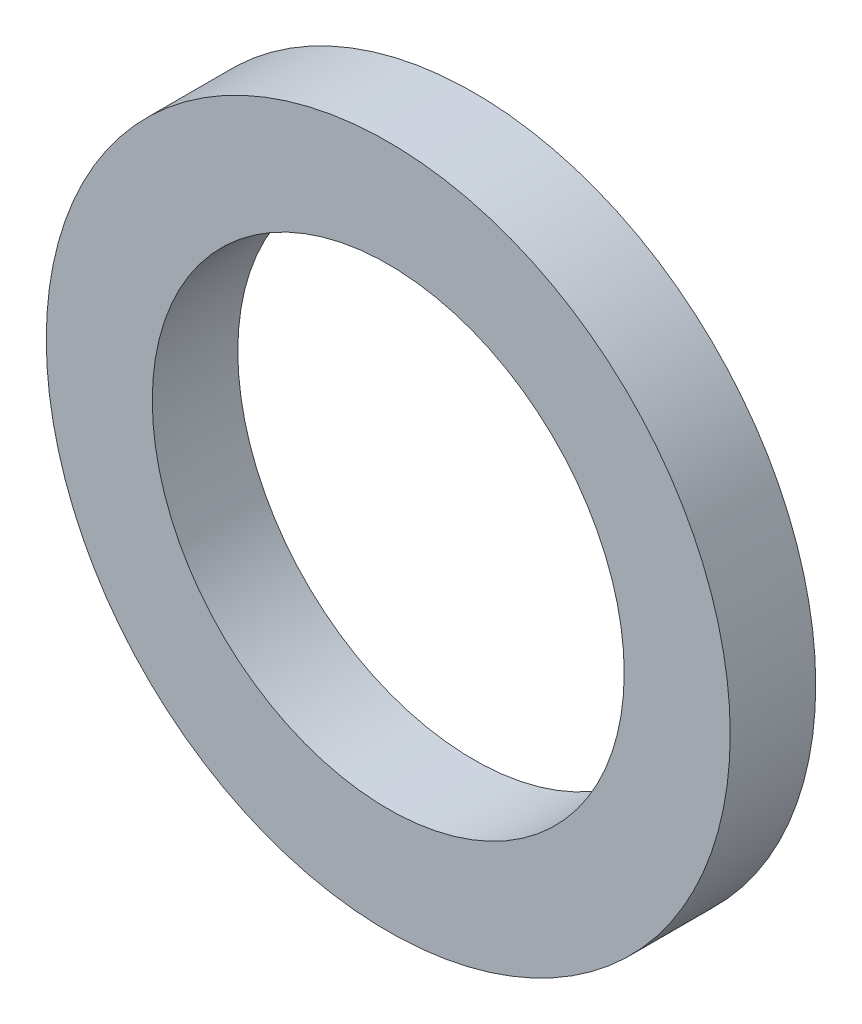
ISO-10303-21;
HEADER;
FILE_DESCRIPTION(('STEP AP214'),'2;1');
FILE_NAME('part.step','',(''),(''),'','','');
FILE_SCHEMA(('AUTOMOTIVE_DESIGN { 1 0 10303 214 1 1 1 1 }'));
ENDSEC;
DATA;
#1=APPLICATION_CONTEXT('core data for automotive mechanical design processes');
#2=APPLICATION_PROTOCOL_DEFINITION('international standard','automotive_design',2000,#1);
#3=PRODUCT_CONTEXT('',#1,'mechanical');
#4=PRODUCT('Part','Part','',(#3));
#5=PRODUCT_RELATED_PRODUCT_CATEGORY('part','',(#4));
#6=PRODUCT_DEFINITION_FORMATION('','',#4);
#7=PRODUCT_DEFINITION_CONTEXT('part definition',#1,'design');
#8=PRODUCT_DEFINITION('design','',#6,#7);
#9=PRODUCT_DEFINITION_SHAPE('','',#8);
#10=(LENGTH_UNIT() NAMED_UNIT(*) SI_UNIT(.MILLI.,.METRE.));
#11=(NAMED_UNIT(*) PLANE_ANGLE_UNIT() SI_UNIT($,.RADIAN.));
#12=(NAMED_UNIT(*) SI_UNIT($,.STERADIAN.) SOLID_ANGLE_UNIT());
#13=UNCERTAINTY_MEASURE_WITH_UNIT(LENGTH_MEASURE(1.E-05),#10,'distance_accuracy_value','');
#14=(GEOMETRIC_REPRESENTATION_CONTEXT(3) GLOBAL_UNCERTAINTY_ASSIGNED_CONTEXT((#13)) GLOBAL_UNIT_ASSIGNED_CONTEXT((#10,
#11,#12)) REPRESENTATION_CONTEXT('',''));
#15=CARTESIAN_POINT('',(0.,0.,0.));
#16=DIRECTION('',(0.,0.,1.));
#17=DIRECTION('',(1.,0.,0.));
#18=AXIS2_PLACEMENT_3D('',#15,#16,#17);
#19=CARTESIAN_POINT('',(0.,0.,3.175));
#20=DIRECTION('',(0.,0.,-1.));
#21=DIRECTION('',(-1.,0.,0.));
#22=AXIS2_PLACEMENT_3D('',#19,#20,#21);
#23=CYLINDRICAL_SURFACE('',#22,12.7);
#24=CARTESIAN_POINT('',(0.,0.,3.175));
#25=DIRECTION('',(0.,0.,1.));
#26=DIRECTION('',(1.,0.,0.));
#27=AXIS2_PLACEMENT_3D('',#24,#25,#26);
#28=CIRCLE('',#27,12.7);
#29=CARTESIAN_POINT('',(12.7,0.,3.175));
#30=VERTEX_POINT('',#29);
#31=EDGE_CURVE('E10',#30,#30,#28,.T.);
#32=ORIENTED_EDGE('',*,*,#31,.F.);
#33=EDGE_LOOP('',(#32));
#34=FACE_BOUND('',#33,.T.);
#35=CARTESIAN_POINT('',(0.,0.,0.));
#36=DIRECTION('',(0.,0.,1.));
#37=DIRECTION('',(1.,0.,0.));
#38=AXIS2_PLACEMENT_3D('',#35,#36,#37);
#39=CIRCLE('',#38,12.7);
#40=CARTESIAN_POINT('',(12.7,0.,0.));
#41=VERTEX_POINT('',#40);
#42=EDGE_CURVE('E38',#41,#41,#39,.T.);
#43=ORIENTED_EDGE('',*,*,#42,.T.);
#44=EDGE_LOOP('',(#43));
#45=FACE_BOUND('',#44,.T.);
#46=ADVANCED_FACE('F35',(#34,#45),#23,.T.);
#47=CARTESIAN_POINT('',(0.,0.,3.175));
#48=DIRECTION('',(0.,0.,1.));
#49=DIRECTION('',(1.,0.,0.));
#50=AXIS2_PLACEMENT_3D('',#47,#48,#49);
#51=PLANE('',#50);
#52=CARTESIAN_POINT('',(0.,0.,3.175));
#53=DIRECTION('',(0.,0.,1.));
#54=DIRECTION('',(1.,0.,0.));
#55=AXIS2_PLACEMENT_3D('',#52,#53,#54);
#56=CIRCLE('',#55,8.763);
#57=CARTESIAN_POINT('',(8.763,0.,3.175));
#58=VERTEX_POINT('',#57);
#59=EDGE_CURVE('E53',#58,#58,#56,.T.);
#60=ORIENTED_EDGE('',*,*,#59,.F.);
#61=EDGE_LOOP('',(#60));
#62=FACE_BOUND('',#61,.T.);
#63=ORIENTED_EDGE('',*,*,#31,.T.);
#64=EDGE_LOOP('',(#63));
#65=FACE_BOUND('',#64,.T.);
#66=ADVANCED_FACE('F59',(#62,#65),#51,.T.);
#67=CARTESIAN_POINT('',(0.,0.,0.));
#68=DIRECTION('',(0.,0.,1.));
#69=DIRECTION('',(1.,0.,0.));
#70=AXIS2_PLACEMENT_3D('',#67,#68,#69);
#71=PLANE('',#70);
#72=CARTESIAN_POINT('',(0.,0.,0.));
#73=DIRECTION('',(0.,0.,1.));
#74=DIRECTION('',(1.,0.,0.));
#75=AXIS2_PLACEMENT_3D('',#72,#73,#74);
#76=CIRCLE('',#75,8.763);
#77=CARTESIAN_POINT('',(8.763,0.,0.));
#78=VERTEX_POINT('',#77);
#79=EDGE_CURVE('E48',#78,#78,#76,.F.);
#80=ORIENTED_EDGE('',*,*,#79,.F.);
#81=EDGE_LOOP('',(#80));
#82=FACE_BOUND('',#81,.T.);
#83=ORIENTED_EDGE('',*,*,#42,.F.);
#84=EDGE_LOOP('',(#83));
#85=FACE_BOUND('',#84,.T.);
#86=ADVANCED_FACE('F61',(#82,#85),#71,.F.);
#87=CARTESIAN_POINT('',(0.,0.,-24.7855068941509));
#88=DIRECTION('',(0.,0.,1.));
#89=DIRECTION('',(1.,0.,0.));
#90=AXIS2_PLACEMENT_3D('',#87,#88,#89);
#91=CYLINDRICAL_SURFACE('',#90,8.763);
#92=ORIENTED_EDGE('',*,*,#79,.T.);
#93=EDGE_LOOP('',(#92));
#94=FACE_BOUND('',#93,.T.);
#95=ORIENTED_EDGE('',*,*,#59,.T.);
#96=EDGE_LOOP('',(#95));
#97=FACE_BOUND('',#96,.T.);
#98=ADVANCED_FACE('F57',(#94,#97),#91,.F.);
#99=CLOSED_SHELL('',(#46,#66,#86,#98));
#100=MANIFOLD_SOLID_BREP('B2',#99);
#101=ADVANCED_BREP_SHAPE_REPRESENTATION('',(#18,#100),#14);
#102=SHAPE_DEFINITION_REPRESENTATION(#9,#101);
ENDSEC;
END-ISO-10303-21;
